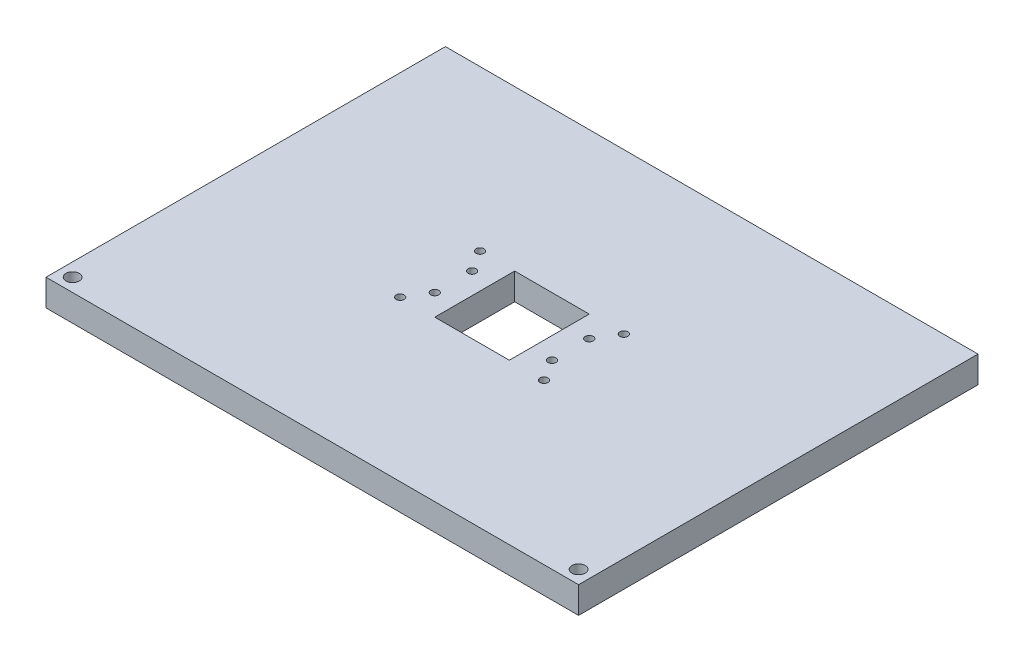
ISO-10303-21;
HEADER;
FILE_DESCRIPTION(('STEP AP214'),'2;1');
FILE_NAME('part.step','',(''),(''),'','','');
FILE_SCHEMA(('AUTOMOTIVE_DESIGN { 1 0 10303 214 1 1 1 1 }'));
ENDSEC;
DATA;
#1=APPLICATION_CONTEXT('core data for automotive mechanical design processes');
#2=APPLICATION_PROTOCOL_DEFINITION('international standard','automotive_design',2000,#1);
#3=PRODUCT_CONTEXT('',#1,'mechanical');
#4=PRODUCT('Part','Part','',(#3));
#5=PRODUCT_RELATED_PRODUCT_CATEGORY('part','',(#4));
#6=PRODUCT_DEFINITION_FORMATION('','',#4);
#7=PRODUCT_DEFINITION_CONTEXT('part definition',#1,'design');
#8=PRODUCT_DEFINITION('design','',#6,#7);
#9=PRODUCT_DEFINITION_SHAPE('','',#8);
#10=(LENGTH_UNIT() NAMED_UNIT(*) SI_UNIT(.MILLI.,.METRE.));
#11=(NAMED_UNIT(*) PLANE_ANGLE_UNIT() SI_UNIT($,.RADIAN.));
#12=(NAMED_UNIT(*) SI_UNIT($,.STERADIAN.) SOLID_ANGLE_UNIT());
#13=UNCERTAINTY_MEASURE_WITH_UNIT(LENGTH_MEASURE(1.E-05),#10,'distance_accuracy_value','');
#14=(GEOMETRIC_REPRESENTATION_CONTEXT(3) GLOBAL_UNCERTAINTY_ASSIGNED_CONTEXT((#13)) GLOBAL_UNIT_ASSIGNED_CONTEXT((#10,
#11,#12)) REPRESENTATION_CONTEXT('',''));
#15=CARTESIAN_POINT('',(0.,0.,0.));
#16=DIRECTION('',(0.,0.,1.));
#17=DIRECTION('',(1.,0.,0.));
#18=AXIS2_PLACEMENT_3D('',#15,#16,#17);
#19=CARTESIAN_POINT('',(100.,30.,10.));
#20=DIRECTION('',(-1.,0.,0.));
#21=DIRECTION('',(0.,0.,1.));
#22=AXIS2_PLACEMENT_3D('',#19,#20,#21);
#23=PLANE('',#22);
#24=DIRECTION('',(0.,0.,1.));
#25=VECTOR('',#24,1.);
#26=CARTESIAN_POINT('',(100.,-20.,-140.));
#27=LINE('',#26,#25);
#28=CARTESIAN_POINT('',(100.,-20.,-140.));
#29=VERTEX_POINT('',#28);
#30=CARTESIAN_POINT('',(100.,-20.,10.));
#31=VERTEX_POINT('',#30);
#32=EDGE_CURVE('E115',#29,#31,#27,.T.);
#33=ORIENTED_EDGE('',*,*,#32,.T.);
#34=DIRECTION('',(0.,1.,0.));
#35=VECTOR('',#34,1.);
#36=CARTESIAN_POINT('',(100.,30.,10.));
#37=LINE('',#36,#35);
#38=CARTESIAN_POINT('',(100.,-30.,10.));
#39=VERTEX_POINT('',#38);
#40=EDGE_CURVE('E114',#39,#31,#37,.T.);
#41=ORIENTED_EDGE('',*,*,#40,.F.);
#42=DIRECTION('',(0.,0.,-1.));
#43=VECTOR('',#42,1.);
#44=CARTESIAN_POINT('',(100.,-30.,10.));
#45=LINE('',#44,#43);
#46=CARTESIAN_POINT('',(100.,-30.,-140.));
#47=VERTEX_POINT('',#46);
#48=EDGE_CURVE('E43',#39,#47,#45,.T.);
#49=ORIENTED_EDGE('',*,*,#48,.T.);
#50=DIRECTION('',(0.,-1.,0.));
#51=VECTOR('',#50,1.);
#52=CARTESIAN_POINT('',(100.,-30.,-140.));
#53=LINE('',#52,#51);
#54=EDGE_CURVE('E134',#29,#47,#53,.T.);
#55=ORIENTED_EDGE('',*,*,#54,.F.);
#56=EDGE_LOOP('',(#33,#41,#49,#55));
#57=FACE_BOUND('',#56,.T.);
#58=ADVANCED_FACE('F35',(#57),#23,.F.);
#59=CARTESIAN_POINT('',(-100.,30.,10.));
#60=DIRECTION('',(1.,0.,0.));
#61=DIRECTION('',(0.,0.,-1.));
#62=AXIS2_PLACEMENT_3D('',#59,#60,#61);
#63=PLANE('',#62);
#64=DIRECTION('',(0.,-1.,0.));
#65=VECTOR('',#64,1.);
#66=CARTESIAN_POINT('',(-100.,30.,10.));
#67=LINE('',#66,#65);
#68=CARTESIAN_POINT('',(-100.,-20.,10.));
#69=VERTEX_POINT('',#68);
#70=CARTESIAN_POINT('',(-100.,-30.,10.));
#71=VERTEX_POINT('',#70);
#72=EDGE_CURVE('E119',#69,#71,#67,.T.);
#73=ORIENTED_EDGE('',*,*,#72,.F.);
#74=DIRECTION('',(0.,0.,1.));
#75=VECTOR('',#74,1.);
#76=CARTESIAN_POINT('',(-100.,-20.,-140.));
#77=LINE('',#76,#75);
#78=CARTESIAN_POINT('',(-100.,-20.,-140.));
#79=VERTEX_POINT('',#78);
#80=EDGE_CURVE('E103',#79,#69,#77,.T.);
#81=ORIENTED_EDGE('',*,*,#80,.F.);
#82=DIRECTION('',(0.,1.,0.));
#83=VECTOR('',#82,1.);
#84=CARTESIAN_POINT('',(-100.,-20.,-140.));
#85=LINE('',#84,#83);
#86=CARTESIAN_POINT('',(-100.,-30.,-140.));
#87=VERTEX_POINT('',#86);
#88=EDGE_CURVE('E174',#87,#79,#85,.T.);
#89=ORIENTED_EDGE('',*,*,#88,.F.);
#90=DIRECTION('',(0.,0.,-1.));
#91=VECTOR('',#90,1.);
#92=CARTESIAN_POINT('',(-100.,-30.,10.));
#93=LINE('',#92,#91);
#94=EDGE_CURVE('E11',#71,#87,#93,.T.);
#95=ORIENTED_EDGE('',*,*,#94,.F.);
#96=EDGE_LOOP('',(#73,#81,#89,#95));
#97=FACE_BOUND('',#96,.T.);
#98=ADVANCED_FACE('F124',(#97),#63,.F.);
#99=CARTESIAN_POINT('',(-100.,-30.,10.));
#100=DIRECTION('',(0.,1.,0.));
#101=DIRECTION('',(0.,0.,1.));
#102=AXIS2_PLACEMENT_3D('',#99,#100,#101);
#103=PLANE('',#102);
#104=CARTESIAN_POINT('',(-95.,-30.,5.));
#105=DIRECTION('',(0.,1.,0.));
#106=DIRECTION('',(0.,0.,1.));
#107=AXIS2_PLACEMENT_3D('',#104,#105,#106);
#108=CIRCLE('',#107,2.5);
#109=CARTESIAN_POINT('',(-95.,-30.,7.5));
#110=VERTEX_POINT('',#109);
#111=EDGE_CURVE('E38',#110,#110,#108,.T.);
#112=ORIENTED_EDGE('',*,*,#111,.T.);
#113=EDGE_LOOP('',(#112));
#114=FACE_BOUND('',#113,.T.);
#115=CARTESIAN_POINT('',(95.,-30.,5.));
#116=DIRECTION('',(0.,1.,0.));
#117=DIRECTION('',(0.,0.,1.));
#118=AXIS2_PLACEMENT_3D('',#115,#116,#117);
#119=CIRCLE('',#118,2.5);
#120=CARTESIAN_POINT('',(95.,-30.,7.5));
#121=VERTEX_POINT('',#120);
#122=EDGE_CURVE('E138',#121,#121,#119,.T.);
#123=ORIENTED_EDGE('',*,*,#122,.T.);
#124=EDGE_LOOP('',(#123));
#125=FACE_BOUND('',#124,.T.);
#126=CARTESIAN_POINT('',(22.,-30.,-58.));
#127=DIRECTION('',(0.,1.,0.));
#128=DIRECTION('',(0.,0.,1.));
#129=AXIS2_PLACEMENT_3D('',#126,#127,#128);
#130=CIRCLE('',#129,1.5);
#131=CARTESIAN_POINT('',(22.,-30.,-56.5));
#132=VERTEX_POINT('',#131);
#133=EDGE_CURVE('E144',#132,#132,#130,.T.);
#134=ORIENTED_EDGE('',*,*,#133,.T.);
#135=EDGE_LOOP('',(#134));
#136=FACE_BOUND('',#135,.T.);
#137=CARTESIAN_POINT('',(22.,-30.,-72.));
#138=DIRECTION('',(0.,1.,0.));
#139=DIRECTION('',(0.,0.,1.));
#140=AXIS2_PLACEMENT_3D('',#137,#138,#139);
#141=CIRCLE('',#140,1.5);
#142=CARTESIAN_POINT('',(22.,-30.,-70.5));
#143=VERTEX_POINT('',#142);
#144=EDGE_CURVE('E243',#143,#143,#141,.T.);
#145=ORIENTED_EDGE('',*,*,#144,.T.);
#146=EDGE_LOOP('',(#145));
#147=FACE_BOUND('',#146,.T.);
#148=CARTESIAN_POINT('',(-22.,-30.,-58.));
#149=DIRECTION('',(0.,1.,0.));
#150=DIRECTION('',(0.,0.,1.));
#151=AXIS2_PLACEMENT_3D('',#148,#149,#150);
#152=CIRCLE('',#151,1.5);
#153=CARTESIAN_POINT('',(-22.,-30.,-56.5));
#154=VERTEX_POINT('',#153);
#155=EDGE_CURVE('E237',#154,#154,#152,.T.);
#156=ORIENTED_EDGE('',*,*,#155,.T.);
#157=EDGE_LOOP('',(#156));
#158=FACE_BOUND('',#157,.T.);
#159=CARTESIAN_POINT('',(-22.,-30.,-72.));
#160=DIRECTION('',(0.,1.,0.));
#161=DIRECTION('',(0.,0.,1.));
#162=AXIS2_PLACEMENT_3D('',#159,#160,#161);
#163=CIRCLE('',#162,1.5);
#164=CARTESIAN_POINT('',(-22.,-30.,-70.5));
#165=VERTEX_POINT('',#164);
#166=EDGE_CURVE('E231',#165,#165,#163,.T.);
#167=ORIENTED_EDGE('',*,*,#166,.T.);
#168=EDGE_LOOP('',(#167));
#169=FACE_BOUND('',#168,.T.);
#170=CARTESIAN_POINT('',(-27.,-30.,-50.));
#171=DIRECTION('',(0.,1.,0.));
#172=DIRECTION('',(0.,0.,1.));
#173=AXIS2_PLACEMENT_3D('',#170,#171,#172);
#174=CIRCLE('',#173,1.5);
#175=CARTESIAN_POINT('',(-27.,-30.,-48.5));
#176=VERTEX_POINT('',#175);
#177=EDGE_CURVE('E225',#176,#176,#174,.T.);
#178=ORIENTED_EDGE('',*,*,#177,.T.);
#179=EDGE_LOOP('',(#178));
#180=FACE_BOUND('',#179,.T.);
#181=CARTESIAN_POINT('',(27.,-30.,-50.));
#182=DIRECTION('',(0.,1.,0.));
#183=DIRECTION('',(0.,0.,1.));
#184=AXIS2_PLACEMENT_3D('',#181,#182,#183);
#185=CIRCLE('',#184,1.5);
#186=CARTESIAN_POINT('',(27.,-30.,-48.5));
#187=VERTEX_POINT('',#186);
#188=EDGE_CURVE('E219',#187,#187,#185,.T.);
#189=ORIENTED_EDGE('',*,*,#188,.T.);
#190=EDGE_LOOP('',(#189));
#191=FACE_BOUND('',#190,.T.);
#192=CARTESIAN_POINT('',(27.,-30.,-80.));
#193=DIRECTION('',(0.,1.,0.));
#194=DIRECTION('',(0.,0.,1.));
#195=AXIS2_PLACEMENT_3D('',#192,#193,#194);
#196=CIRCLE('',#195,1.5);
#197=CARTESIAN_POINT('',(27.,-30.,-78.5));
#198=VERTEX_POINT('',#197);
#199=EDGE_CURVE('E213',#198,#198,#196,.T.);
#200=ORIENTED_EDGE('',*,*,#199,.T.);
#201=EDGE_LOOP('',(#200));
#202=FACE_BOUND('',#201,.T.);
#203=CARTESIAN_POINT('',(-27.,-30.,-80.));
#204=DIRECTION('',(0.,1.,0.));
#205=DIRECTION('',(0.,0.,1.));
#206=AXIS2_PLACEMENT_3D('',#203,#204,#205);
#207=CIRCLE('',#206,1.5);
#208=CARTESIAN_POINT('',(-27.,-30.,-78.5));
#209=VERTEX_POINT('',#208);
#210=EDGE_CURVE('E207',#209,#209,#207,.T.);
#211=ORIENTED_EDGE('',*,*,#210,.T.);
#212=EDGE_LOOP('',(#211));
#213=FACE_BOUND('',#212,.T.);
#214=DIRECTION('',(-1.,0.,0.));
#215=VECTOR('',#214,1.);
#216=CARTESIAN_POINT('',(-100.,-30.,-80.));
#217=LINE('',#216,#215);
#218=CARTESIAN_POINT('',(14.,-30.,-80.));
#219=VERTEX_POINT('',#218);
#220=CARTESIAN_POINT('',(-14.,-30.,-80.));
#221=VERTEX_POINT('',#220);
#222=EDGE_CURVE('E51',#219,#221,#217,.T.);
#223=ORIENTED_EDGE('',*,*,#222,.T.);
#224=DIRECTION('',(0.,0.,1.));
#225=VECTOR('',#224,1.);
#226=CARTESIAN_POINT('',(-14.,-30.,9.99999999999998));
#227=LINE('',#226,#225);
#228=CARTESIAN_POINT('',(-14.,-30.,-50.));
#229=VERTEX_POINT('',#228);
#230=EDGE_CURVE('E196',#221,#229,#227,.T.);
#231=ORIENTED_EDGE('',*,*,#230,.T.);
#232=DIRECTION('',(1.,0.,0.));
#233=VECTOR('',#232,1.);
#234=CARTESIAN_POINT('',(-100.,-30.,-50.));
#235=LINE('',#234,#233);
#236=CARTESIAN_POINT('',(14.,-30.,-50.));
#237=VERTEX_POINT('',#236);
#238=EDGE_CURVE('E182',#229,#237,#235,.T.);
#239=ORIENTED_EDGE('',*,*,#238,.T.);
#240=DIRECTION('',(0.,0.,-1.));
#241=VECTOR('',#240,1.);
#242=CARTESIAN_POINT('',(14.,-30.,9.99999999999999));
#243=LINE('',#242,#241);
#244=EDGE_CURVE('E180',#237,#219,#243,.T.);
#245=ORIENTED_EDGE('',*,*,#244,.T.);
#246=EDGE_LOOP('',(#223,#231,#239,#245));
#247=FACE_BOUND('',#246,.T.);
#248=ORIENTED_EDGE('',*,*,#94,.T.);
#249=DIRECTION('',(-1.,0.,0.));
#250=VECTOR('',#249,1.);
#251=CARTESIAN_POINT('',(-100.,-30.,-140.));
#252=LINE('',#251,#250);
#253=EDGE_CURVE('E178',#47,#87,#252,.T.);
#254=ORIENTED_EDGE('',*,*,#253,.F.);
#255=ORIENTED_EDGE('',*,*,#48,.F.);
#256=DIRECTION('',(1.,0.,0.));
#257=VECTOR('',#256,1.);
#258=CARTESIAN_POINT('',(-100.,-30.,10.));
#259=LINE('',#258,#257);
#260=EDGE_CURVE('E126',#71,#39,#259,.T.);
#261=ORIENTED_EDGE('',*,*,#260,.F.);
#262=EDGE_LOOP('',(#248,#254,#255,#261));
#263=FACE_BOUND('',#262,.T.);
#264=ADVANCED_FACE('F149',(#114,#125,#136,#147,#158,#169,#180,#191,#202,#213,#247,#263),#103,.F.);
#265=CARTESIAN_POINT('',(0.,0.,10.));
#266=DIRECTION('',(0.,0.,1.));
#267=DIRECTION('',(1.,0.,0.));
#268=AXIS2_PLACEMENT_3D('',#265,#266,#267);
#269=PLANE('',#268);
#270=DIRECTION('',(1.,0.,0.));
#271=VECTOR('',#270,1.);
#272=CARTESIAN_POINT('',(0.,-20.,10.));
#273=LINE('',#272,#271);
#274=EDGE_CURVE('E108',#69,#31,#273,.T.);
#275=ORIENTED_EDGE('',*,*,#274,.F.);
#276=ORIENTED_EDGE('',*,*,#72,.T.);
#277=ORIENTED_EDGE('',*,*,#260,.T.);
#278=ORIENTED_EDGE('',*,*,#40,.T.);
#279=EDGE_LOOP('',(#275,#276,#277,#278));
#280=FACE_BOUND('',#279,.T.);
#281=ADVANCED_FACE('F118',(#280),#269,.T.);
#282=CARTESIAN_POINT('',(100.,-20.,-140.));
#283=DIRECTION('',(0.,-1.,0.));
#284=DIRECTION('',(1.,0.,0.));
#285=AXIS2_PLACEMENT_3D('',#282,#283,#284);
#286=PLANE('',#285);
#287=CARTESIAN_POINT('',(22.,-20.,-58.));
#288=DIRECTION('',(0.,1.,0.));
#289=DIRECTION('',(0.,0.,-1.));
#290=AXIS2_PLACEMENT_3D('',#287,#288,#289);
#291=CIRCLE('',#290,1.5);
#292=CARTESIAN_POINT('',(22.,-20.,-59.5));
#293=VERTEX_POINT('',#292);
#294=EDGE_CURVE('E140',#293,#293,#291,.T.);
#295=ORIENTED_EDGE('',*,*,#294,.F.);
#296=EDGE_LOOP('',(#295));
#297=FACE_BOUND('',#296,.T.);
#298=CARTESIAN_POINT('',(22.,-20.,-72.));
#299=DIRECTION('',(0.,1.,0.));
#300=DIRECTION('',(0.,0.,-1.));
#301=AXIS2_PLACEMENT_3D('',#298,#299,#300);
#302=CIRCLE('',#301,1.5);
#303=CARTESIAN_POINT('',(22.,-20.,-73.5));
#304=VERTEX_POINT('',#303);
#305=EDGE_CURVE('E246',#304,#304,#302,.T.);
#306=ORIENTED_EDGE('',*,*,#305,.F.);
#307=EDGE_LOOP('',(#306));
#308=FACE_BOUND('',#307,.T.);
#309=CARTESIAN_POINT('',(-22.,-20.,-58.));
#310=DIRECTION('',(0.,1.,0.));
#311=DIRECTION('',(0.,0.,1.));
#312=AXIS2_PLACEMENT_3D('',#309,#310,#311);
#313=CIRCLE('',#312,1.5);
#314=CARTESIAN_POINT('',(-22.,-20.,-56.5));
#315=VERTEX_POINT('',#314);
#316=EDGE_CURVE('E240',#315,#315,#313,.T.);
#317=ORIENTED_EDGE('',*,*,#316,.F.);
#318=EDGE_LOOP('',(#317));
#319=FACE_BOUND('',#318,.T.);
#320=CARTESIAN_POINT('',(-22.,-20.,-72.));
#321=DIRECTION('',(0.,1.,0.));
#322=DIRECTION('',(0.,0.,1.));
#323=AXIS2_PLACEMENT_3D('',#320,#321,#322);
#324=CIRCLE('',#323,1.5);
#325=CARTESIAN_POINT('',(-22.,-20.,-70.5));
#326=VERTEX_POINT('',#325);
#327=EDGE_CURVE('E234',#326,#326,#324,.T.);
#328=ORIENTED_EDGE('',*,*,#327,.F.);
#329=EDGE_LOOP('',(#328));
#330=FACE_BOUND('',#329,.T.);
#331=CARTESIAN_POINT('',(-27.,-20.,-50.));
#332=DIRECTION('',(0.,1.,0.));
#333=DIRECTION('',(0.,0.,1.));
#334=AXIS2_PLACEMENT_3D('',#331,#332,#333);
#335=CIRCLE('',#334,1.5);
#336=CARTESIAN_POINT('',(-27.,-20.,-48.5));
#337=VERTEX_POINT('',#336);
#338=EDGE_CURVE('E228',#337,#337,#335,.T.);
#339=ORIENTED_EDGE('',*,*,#338,.F.);
#340=EDGE_LOOP('',(#339));
#341=FACE_BOUND('',#340,.T.);
#342=CARTESIAN_POINT('',(27.,-20.,-50.));
#343=DIRECTION('',(0.,1.,0.));
#344=DIRECTION('',(0.,0.,1.));
#345=AXIS2_PLACEMENT_3D('',#342,#343,#344);
#346=CIRCLE('',#345,1.5);
#347=CARTESIAN_POINT('',(27.,-20.,-48.5));
#348=VERTEX_POINT('',#347);
#349=EDGE_CURVE('E222',#348,#348,#346,.T.);
#350=ORIENTED_EDGE('',*,*,#349,.F.);
#351=EDGE_LOOP('',(#350));
#352=FACE_BOUND('',#351,.T.);
#353=CARTESIAN_POINT('',(27.,-20.,-80.));
#354=DIRECTION('',(0.,1.,0.));
#355=DIRECTION('',(0.,0.,1.));
#356=AXIS2_PLACEMENT_3D('',#353,#354,#355);
#357=CIRCLE('',#356,1.5);
#358=CARTESIAN_POINT('',(27.,-20.,-78.5));
#359=VERTEX_POINT('',#358);
#360=EDGE_CURVE('E216',#359,#359,#357,.T.);
#361=ORIENTED_EDGE('',*,*,#360,.F.);
#362=EDGE_LOOP('',(#361));
#363=FACE_BOUND('',#362,.T.);
#364=CARTESIAN_POINT('',(-27.,-20.,-80.));
#365=DIRECTION('',(0.,1.,0.));
#366=DIRECTION('',(0.,0.,1.));
#367=AXIS2_PLACEMENT_3D('',#364,#365,#366);
#368=CIRCLE('',#367,1.5);
#369=CARTESIAN_POINT('',(-27.,-20.,-78.5));
#370=VERTEX_POINT('',#369);
#371=EDGE_CURVE('E210',#370,#370,#368,.T.);
#372=ORIENTED_EDGE('',*,*,#371,.F.);
#373=EDGE_LOOP('',(#372));
#374=FACE_BOUND('',#373,.T.);
#375=DIRECTION('',(0.,0.,1.));
#376=VECTOR('',#375,1.);
#377=CARTESIAN_POINT('',(-14.,-20.,-80.));
#378=LINE('',#377,#376);
#379=CARTESIAN_POINT('',(-14.,-20.,-80.));
#380=VERTEX_POINT('',#379);
#381=CARTESIAN_POINT('',(-14.,-20.,-50.));
#382=VERTEX_POINT('',#381);
#383=EDGE_CURVE('E202',#380,#382,#378,.T.);
#384=ORIENTED_EDGE('',*,*,#383,.F.);
#385=DIRECTION('',(-1.,0.,0.));
#386=VECTOR('',#385,1.);
#387=CARTESIAN_POINT('',(3.99999999999999,-20.,-80.));
#388=LINE('',#387,#386);
#389=CARTESIAN_POINT('',(14.,-20.,-80.));
#390=VERTEX_POINT('',#389);
#391=EDGE_CURVE('E193',#390,#380,#388,.T.);
#392=ORIENTED_EDGE('',*,*,#391,.F.);
#393=DIRECTION('',(0.,0.,-1.));
#394=VECTOR('',#393,1.);
#395=CARTESIAN_POINT('',(14.,-20.,-80.));
#396=LINE('',#395,#394);
#397=CARTESIAN_POINT('',(14.,-20.,-50.));
#398=VERTEX_POINT('',#397);
#399=EDGE_CURVE('E59',#398,#390,#396,.T.);
#400=ORIENTED_EDGE('',*,*,#399,.F.);
#401=DIRECTION('',(1.,0.,0.));
#402=VECTOR('',#401,1.);
#403=CARTESIAN_POINT('',(3.99999999999999,-20.,-50.));
#404=LINE('',#403,#402);
#405=EDGE_CURVE('E189',#382,#398,#404,.T.);
#406=ORIENTED_EDGE('',*,*,#405,.F.);
#407=EDGE_LOOP('',(#384,#392,#400,#406));
#408=FACE_BOUND('',#407,.T.);
#409=ORIENTED_EDGE('',*,*,#80,.T.);
#410=ORIENTED_EDGE('',*,*,#274,.T.);
#411=ORIENTED_EDGE('',*,*,#32,.F.);
#412=DIRECTION('',(1.,0.,0.));
#413=VECTOR('',#412,1.);
#414=CARTESIAN_POINT('',(100.,-20.,-140.));
#415=LINE('',#414,#413);
#416=EDGE_CURVE('E110',#79,#29,#415,.T.);
#417=ORIENTED_EDGE('',*,*,#416,.F.);
#418=EDGE_LOOP('',(#409,#410,#411,#417));
#419=FACE_BOUND('',#418,.T.);
#420=CARTESIAN_POINT('',(95.,-20.,5.));
#421=DIRECTION('',(0.,-1.,0.));
#422=DIRECTION('',(0.,0.,-1.));
#423=AXIS2_PLACEMENT_3D('',#420,#421,#422);
#424=CIRCLE('',#423,2.5);
#425=CARTESIAN_POINT('',(95.,-20.,2.5));
#426=VERTEX_POINT('',#425);
#427=EDGE_CURVE('E122',#426,#426,#424,.F.);
#428=ORIENTED_EDGE('',*,*,#427,.F.);
#429=EDGE_LOOP('',(#428));
#430=FACE_BOUND('',#429,.T.);
#431=CARTESIAN_POINT('',(-95.,-20.,5.));
#432=DIRECTION('',(0.,-1.,0.));
#433=DIRECTION('',(0.,0.,-1.));
#434=AXIS2_PLACEMENT_3D('',#431,#432,#433);
#435=CIRCLE('',#434,2.5);
#436=CARTESIAN_POINT('',(-95.,-20.,2.5));
#437=VERTEX_POINT('',#436);
#438=EDGE_CURVE('E253',#437,#437,#435,.F.);
#439=ORIENTED_EDGE('',*,*,#438,.F.);
#440=EDGE_LOOP('',(#439));
#441=FACE_BOUND('',#440,.T.);
#442=ADVANCED_FACE('F105',(#297,#308,#319,#330,#341,#352,#363,#374,#408,#419,#430,#441),#286,.F.);
#443=CARTESIAN_POINT('',(0.,0.,-140.));
#444=DIRECTION('',(0.,0.,1.));
#445=DIRECTION('',(1.,0.,0.));
#446=AXIS2_PLACEMENT_3D('',#443,#444,#445);
#447=PLANE('',#446);
#448=ORIENTED_EDGE('',*,*,#253,.T.);
#449=ORIENTED_EDGE('',*,*,#88,.T.);
#450=ORIENTED_EDGE('',*,*,#416,.T.);
#451=ORIENTED_EDGE('',*,*,#54,.T.);
#452=EDGE_LOOP('',(#448,#449,#450,#451));
#453=FACE_BOUND('',#452,.T.);
#454=ADVANCED_FACE('F257',(#453),#447,.F.);
#455=CARTESIAN_POINT('',(14.,-50.,-80.));
#456=DIRECTION('',(1.,0.,0.));
#457=DIRECTION('',(0.,0.,-1.));
#458=AXIS2_PLACEMENT_3D('',#455,#456,#457);
#459=PLANE('',#458);
#460=DIRECTION('',(0.,1.,0.));
#461=VECTOR('',#460,1.);
#462=CARTESIAN_POINT('',(14.,-50.,-50.));
#463=LINE('',#462,#461);
#464=EDGE_CURVE('E186',#237,#398,#463,.T.);
#465=ORIENTED_EDGE('',*,*,#464,.T.);
#466=ORIENTED_EDGE('',*,*,#399,.T.);
#467=DIRECTION('',(0.,1.,0.));
#468=VECTOR('',#467,1.);
#469=CARTESIAN_POINT('',(14.,-50.,-80.));
#470=LINE('',#469,#468);
#471=EDGE_CURVE('E187',#219,#390,#470,.T.);
#472=ORIENTED_EDGE('',*,*,#471,.F.);
#473=ORIENTED_EDGE('',*,*,#244,.F.);
#474=EDGE_LOOP('',(#465,#466,#472,#473));
#475=FACE_BOUND('',#474,.T.);
#476=ADVANCED_FACE('F264',(#475),#459,.F.);
#477=CARTESIAN_POINT('',(3.99999999999999,-50.,-50.));
#478=DIRECTION('',(0.,0.,1.));
#479=DIRECTION('',(1.,0.,0.));
#480=AXIS2_PLACEMENT_3D('',#477,#478,#479);
#481=PLANE('',#480);
#482=ORIENTED_EDGE('',*,*,#238,.F.);
#483=DIRECTION('',(0.,1.,0.));
#484=VECTOR('',#483,1.);
#485=CARTESIAN_POINT('',(-14.,-50.,-50.));
#486=LINE('',#485,#484);
#487=EDGE_CURVE('E198',#229,#382,#486,.T.);
#488=ORIENTED_EDGE('',*,*,#487,.T.);
#489=ORIENTED_EDGE('',*,*,#405,.T.);
#490=ORIENTED_EDGE('',*,*,#464,.F.);
#491=EDGE_LOOP('',(#482,#488,#489,#490));
#492=FACE_BOUND('',#491,.T.);
#493=ADVANCED_FACE('F403',(#492),#481,.F.);
#494=CARTESIAN_POINT('',(3.99999999999999,-50.,-80.));
#495=DIRECTION('',(0.,0.,-1.));
#496=DIRECTION('',(-1.,0.,0.));
#497=AXIS2_PLACEMENT_3D('',#494,#495,#496);
#498=PLANE('',#497);
#499=ORIENTED_EDGE('',*,*,#471,.T.);
#500=ORIENTED_EDGE('',*,*,#391,.T.);
#501=DIRECTION('',(0.,1.,0.));
#502=VECTOR('',#501,1.);
#503=CARTESIAN_POINT('',(-14.,-50.,-80.));
#504=LINE('',#503,#502);
#505=EDGE_CURVE('E199',#221,#380,#504,.T.);
#506=ORIENTED_EDGE('',*,*,#505,.F.);
#507=ORIENTED_EDGE('',*,*,#222,.F.);
#508=EDGE_LOOP('',(#499,#500,#506,#507));
#509=FACE_BOUND('',#508,.T.);
#510=ADVANCED_FACE('F391',(#509),#498,.F.);
#511=CARTESIAN_POINT('',(-14.,-50.,-80.));
#512=DIRECTION('',(-1.,0.,0.));
#513=DIRECTION('',(0.,0.,1.));
#514=AXIS2_PLACEMENT_3D('',#511,#512,#513);
#515=PLANE('',#514);
#516=ORIENTED_EDGE('',*,*,#505,.T.);
#517=ORIENTED_EDGE('',*,*,#383,.T.);
#518=ORIENTED_EDGE('',*,*,#487,.F.);
#519=ORIENTED_EDGE('',*,*,#230,.F.);
#520=EDGE_LOOP('',(#516,#517,#518,#519));
#521=FACE_BOUND('',#520,.T.);
#522=ADVANCED_FACE('F381',(#521),#515,.F.);
#523=CARTESIAN_POINT('',(-27.,-40.,-80.));
#524=DIRECTION('',(0.,1.,0.));
#525=DIRECTION('',(0.,0.,1.));
#526=AXIS2_PLACEMENT_3D('',#523,#524,#525);
#527=CYLINDRICAL_SURFACE('',#526,1.5);
#528=ORIENTED_EDGE('',*,*,#371,.T.);
#529=EDGE_LOOP('',(#528));
#530=FACE_BOUND('',#529,.T.);
#531=ORIENTED_EDGE('',*,*,#210,.F.);
#532=EDGE_LOOP('',(#531));
#533=FACE_BOUND('',#532,.T.);
#534=ADVANCED_FACE('F371',(#530,#533),#527,.F.);
#535=CARTESIAN_POINT('',(27.,-40.,-80.));
#536=DIRECTION('',(0.,1.,0.));
#537=DIRECTION('',(0.,0.,1.));
#538=AXIS2_PLACEMENT_3D('',#535,#536,#537);
#539=CYLINDRICAL_SURFACE('',#538,1.5);
#540=ORIENTED_EDGE('',*,*,#360,.T.);
#541=EDGE_LOOP('',(#540));
#542=FACE_BOUND('',#541,.T.);
#543=ORIENTED_EDGE('',*,*,#199,.F.);
#544=EDGE_LOOP('',(#543));
#545=FACE_BOUND('',#544,.T.);
#546=ADVANCED_FACE('F361',(#542,#545),#539,.F.);
#547=CARTESIAN_POINT('',(27.,-40.,-50.));
#548=DIRECTION('',(0.,1.,0.));
#549=DIRECTION('',(0.,0.,1.));
#550=AXIS2_PLACEMENT_3D('',#547,#548,#549);
#551=CYLINDRICAL_SURFACE('',#550,1.5);
#552=ORIENTED_EDGE('',*,*,#349,.T.);
#553=EDGE_LOOP('',(#552));
#554=FACE_BOUND('',#553,.T.);
#555=ORIENTED_EDGE('',*,*,#188,.F.);
#556=EDGE_LOOP('',(#555));
#557=FACE_BOUND('',#556,.T.);
#558=ADVANCED_FACE('F351',(#554,#557),#551,.F.);
#559=CARTESIAN_POINT('',(-27.,-40.,-50.));
#560=DIRECTION('',(0.,1.,0.));
#561=DIRECTION('',(0.,0.,1.));
#562=AXIS2_PLACEMENT_3D('',#559,#560,#561);
#563=CYLINDRICAL_SURFACE('',#562,1.5);
#564=ORIENTED_EDGE('',*,*,#338,.T.);
#565=EDGE_LOOP('',(#564));
#566=FACE_BOUND('',#565,.T.);
#567=ORIENTED_EDGE('',*,*,#177,.F.);
#568=EDGE_LOOP('',(#567));
#569=FACE_BOUND('',#568,.T.);
#570=ADVANCED_FACE('F341',(#566,#569),#563,.F.);
#571=CARTESIAN_POINT('',(-22.,-40.,-72.));
#572=DIRECTION('',(0.,1.,0.));
#573=DIRECTION('',(0.,0.,1.));
#574=AXIS2_PLACEMENT_3D('',#571,#572,#573);
#575=CYLINDRICAL_SURFACE('',#574,1.5);
#576=ORIENTED_EDGE('',*,*,#327,.T.);
#577=EDGE_LOOP('',(#576));
#578=FACE_BOUND('',#577,.T.);
#579=ORIENTED_EDGE('',*,*,#166,.F.);
#580=EDGE_LOOP('',(#579));
#581=FACE_BOUND('',#580,.T.);
#582=ADVANCED_FACE('F331',(#578,#581),#575,.F.);
#583=CARTESIAN_POINT('',(-22.,-40.,-58.));
#584=DIRECTION('',(0.,1.,0.));
#585=DIRECTION('',(0.,0.,1.));
#586=AXIS2_PLACEMENT_3D('',#583,#584,#585);
#587=CYLINDRICAL_SURFACE('',#586,1.5);
#588=ORIENTED_EDGE('',*,*,#316,.T.);
#589=EDGE_LOOP('',(#588));
#590=FACE_BOUND('',#589,.T.);
#591=ORIENTED_EDGE('',*,*,#155,.F.);
#592=EDGE_LOOP('',(#591));
#593=FACE_BOUND('',#592,.T.);
#594=ADVANCED_FACE('F321',(#590,#593),#587,.F.);
#595=CARTESIAN_POINT('',(22.,-40.,-72.));
#596=DIRECTION('',(0.,1.,0.));
#597=DIRECTION('',(0.,0.,1.));
#598=AXIS2_PLACEMENT_3D('',#595,#596,#597);
#599=CYLINDRICAL_SURFACE('',#598,1.5);
#600=ORIENTED_EDGE('',*,*,#305,.T.);
#601=EDGE_LOOP('',(#600));
#602=FACE_BOUND('',#601,.T.);
#603=ORIENTED_EDGE('',*,*,#144,.F.);
#604=EDGE_LOOP('',(#603));
#605=FACE_BOUND('',#604,.T.);
#606=ADVANCED_FACE('F311',(#602,#605),#599,.F.);
#607=CARTESIAN_POINT('',(22.,-40.,-58.));
#608=DIRECTION('',(0.,1.,0.));
#609=DIRECTION('',(0.,0.,1.));
#610=AXIS2_PLACEMENT_3D('',#607,#608,#609);
#611=CYLINDRICAL_SURFACE('',#610,1.5);
#612=ORIENTED_EDGE('',*,*,#294,.T.);
#613=EDGE_LOOP('',(#612));
#614=FACE_BOUND('',#613,.T.);
#615=ORIENTED_EDGE('',*,*,#133,.F.);
#616=EDGE_LOOP('',(#615));
#617=FACE_BOUND('',#616,.T.);
#618=ADVANCED_FACE('F159',(#614,#617),#611,.F.);
#619=CARTESIAN_POINT('',(95.,-40.,5.));
#620=DIRECTION('',(0.,1.,0.));
#621=DIRECTION('',(0.,0.,1.));
#622=AXIS2_PLACEMENT_3D('',#619,#620,#621);
#623=CYLINDRICAL_SURFACE('',#622,2.5);
#624=ORIENTED_EDGE('',*,*,#427,.T.);
#625=EDGE_LOOP('',(#624));
#626=FACE_BOUND('',#625,.T.);
#627=ORIENTED_EDGE('',*,*,#122,.F.);
#628=EDGE_LOOP('',(#627));
#629=FACE_BOUND('',#628,.T.);
#630=ADVANCED_FACE('F153',(#626,#629),#623,.F.);
#631=CARTESIAN_POINT('',(-95.,-40.,5.));
#632=DIRECTION('',(0.,1.,0.));
#633=DIRECTION('',(0.,0.,1.));
#634=AXIS2_PLACEMENT_3D('',#631,#632,#633);
#635=CYLINDRICAL_SURFACE('',#634,2.5);
#636=ORIENTED_EDGE('',*,*,#438,.T.);
#637=EDGE_LOOP('',(#636));
#638=FACE_BOUND('',#637,.T.);
#639=ORIENTED_EDGE('',*,*,#111,.F.);
#640=EDGE_LOOP('',(#639));
#641=FACE_BOUND('',#640,.T.);
#642=ADVANCED_FACE('F151',(#638,#641),#635,.F.);
#643=CLOSED_SHELL('',(#58,#98,#264,#281,#442,#454,#476,#493,#510,#522,#534,#546,#558,#570,#582,
#594,#606,#618,#630,#642));
#644=MANIFOLD_SOLID_BREP('B2',#643);
#645=ADVANCED_BREP_SHAPE_REPRESENTATION('',(#18,#644),#14);
#646=SHAPE_DEFINITION_REPRESENTATION(#9,#645);
ENDSEC;
END-ISO-10303-21;
